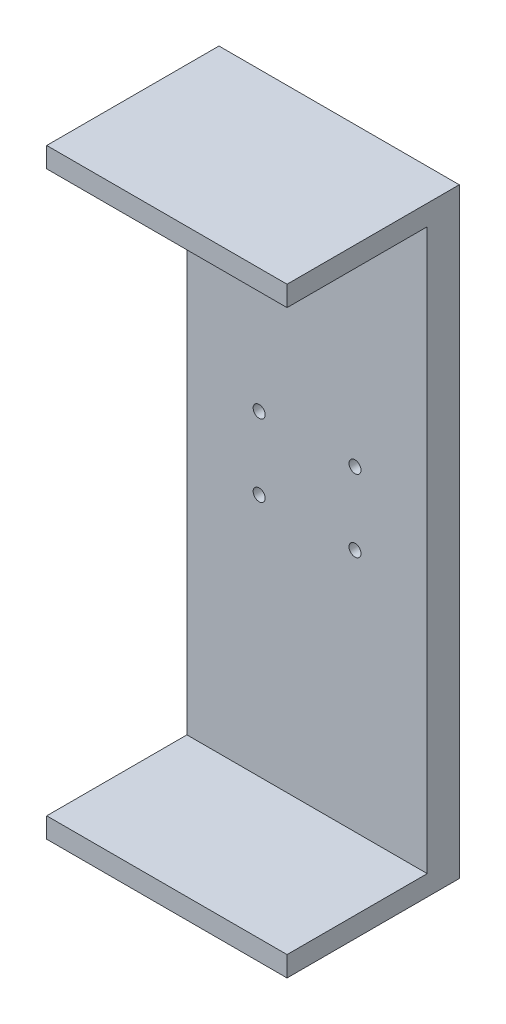
ISO-10303-21;
HEADER;
FILE_DESCRIPTION(('STEP AP214'),'2;1');
FILE_NAME('part.step','',(''),(''),'','','');
FILE_SCHEMA(('AUTOMOTIVE_DESIGN { 1 0 10303 214 1 1 1 1 }'));
ENDSEC;
DATA;
#1=APPLICATION_CONTEXT('core data for automotive mechanical design processes');
#2=APPLICATION_PROTOCOL_DEFINITION('international standard','automotive_design',2000,#1);
#3=PRODUCT_CONTEXT('',#1,'mechanical');
#4=PRODUCT('Part','Part','',(#3));
#5=PRODUCT_RELATED_PRODUCT_CATEGORY('part','',(#4));
#6=PRODUCT_DEFINITION_FORMATION('','',#4);
#7=PRODUCT_DEFINITION_CONTEXT('part definition',#1,'design');
#8=PRODUCT_DEFINITION('design','',#6,#7);
#9=PRODUCT_DEFINITION_SHAPE('','',#8);
#10=(LENGTH_UNIT() NAMED_UNIT(*) SI_UNIT(.MILLI.,.METRE.));
#11=(NAMED_UNIT(*) PLANE_ANGLE_UNIT() SI_UNIT($,.RADIAN.));
#12=(NAMED_UNIT(*) SI_UNIT($,.STERADIAN.) SOLID_ANGLE_UNIT());
#13=UNCERTAINTY_MEASURE_WITH_UNIT(LENGTH_MEASURE(1.E-05),#10,'distance_accuracy_value','');
#14=(GEOMETRIC_REPRESENTATION_CONTEXT(3) GLOBAL_UNCERTAINTY_ASSIGNED_CONTEXT((#13)) GLOBAL_UNIT_ASSIGNED_CONTEXT((#10,
#11,#12)) REPRESENTATION_CONTEXT('',''));
#15=CARTESIAN_POINT('',(0.,0.,0.));
#16=DIRECTION('',(0.,0.,1.));
#17=DIRECTION('',(1.,0.,0.));
#18=AXIS2_PLACEMENT_3D('',#15,#16,#17);
#19=CARTESIAN_POINT('',(0.,0.,8.));
#20=DIRECTION('',(0.,0.,1.));
#21=DIRECTION('',(1.,0.,0.));
#22=AXIS2_PLACEMENT_3D('',#19,#20,#21);
#23=PLANE('',#22);
#24=CARTESIAN_POINT('',(4.67,5.98317831307483,8.));
#25=DIRECTION('',(0.,0.,1.));
#26=DIRECTION('',(1.,0.,0.));
#27=AXIS2_PLACEMENT_3D('',#24,#25,#26);
#28=CIRCLE('',#27,1.5);
#29=CARTESIAN_POINT('',(6.17,5.98317831307483,8.));
#30=VERTEX_POINT('',#29);
#31=EDGE_CURVE('E175',#30,#30,#28,.T.);
#32=ORIENTED_EDGE('',*,*,#31,.F.);
#33=EDGE_LOOP('',(#32));
#34=FACE_BOUND('',#33,.T.);
#35=CARTESIAN_POINT('',(28.6,24.0168216869252,8.));
#36=DIRECTION('',(0.,0.,1.));
#37=DIRECTION('',(1.,0.,0.));
#38=AXIS2_PLACEMENT_3D('',#35,#36,#37);
#39=CIRCLE('',#38,1.5);
#40=CARTESIAN_POINT('',(30.1,24.0168216869252,8.));
#41=VERTEX_POINT('',#40);
#42=EDGE_CURVE('E191',#41,#41,#39,.T.);
#43=ORIENTED_EDGE('',*,*,#42,.F.);
#44=EDGE_LOOP('',(#43));
#45=FACE_BOUND('',#44,.T.);
#46=CARTESIAN_POINT('',(28.6,5.98317831307483,8.));
#47=DIRECTION('',(0.,0.,1.));
#48=DIRECTION('',(-1.,0.,0.));
#49=AXIS2_PLACEMENT_3D('',#46,#47,#48);
#50=CIRCLE('',#49,1.5);
#51=CARTESIAN_POINT('',(27.1,5.98317831307483,8.));
#52=VERTEX_POINT('',#51);
#53=EDGE_CURVE('E183',#52,#52,#50,.T.);
#54=ORIENTED_EDGE('',*,*,#53,.F.);
#55=EDGE_LOOP('',(#54));
#56=FACE_BOUND('',#55,.T.);
#57=CARTESIAN_POINT('',(4.67,24.0168216869252,8.));
#58=DIRECTION('',(0.,0.,1.));
#59=DIRECTION('',(-1.,0.,0.));
#60=AXIS2_PLACEMENT_3D('',#57,#58,#59);
#61=CIRCLE('',#60,1.5);
#62=CARTESIAN_POINT('',(3.17,24.0168216869252,8.));
#63=VERTEX_POINT('',#62);
#64=EDGE_CURVE('E167',#63,#63,#61,.T.);
#65=ORIENTED_EDGE('',*,*,#64,.F.);
#66=EDGE_LOOP('',(#65));
#67=FACE_BOUND('',#66,.T.);
#68=DIRECTION('',(0.,-1.,0.));
#69=VECTOR('',#68,1.);
#70=CARTESIAN_POINT('',(-13.365,90.,8.));
#71=LINE('',#70,#69);
#72=CARTESIAN_POINT('',(-13.365,84.9335711848288,8.));
#73=VERTEX_POINT('',#72);
#74=CARTESIAN_POINT('',(-13.365,-54.9335711848287,8.));
#75=VERTEX_POINT('',#74);
#76=EDGE_CURVE('E64',#73,#75,#71,.T.);
#77=ORIENTED_EDGE('',*,*,#76,.T.);
#78=DIRECTION('',(-1.,0.,0.));
#79=VECTOR('',#78,1.);
#80=CARTESIAN_POINT('',(-13.365,-54.9335711848287,8.));
#81=LINE('',#80,#79);
#82=CARTESIAN_POINT('',(46.635,-54.9335711848287,8.));
#83=VERTEX_POINT('',#82);
#84=EDGE_CURVE('E59',#83,#75,#81,.T.);
#85=ORIENTED_EDGE('',*,*,#84,.F.);
#86=DIRECTION('',(0.,1.,0.));
#87=VECTOR('',#86,1.);
#88=CARTESIAN_POINT('',(46.635,90.,8.));
#89=LINE('',#88,#87);
#90=CARTESIAN_POINT('',(46.635,84.9335711848288,8.));
#91=VERTEX_POINT('',#90);
#92=EDGE_CURVE('E199',#83,#91,#89,.T.);
#93=ORIENTED_EDGE('',*,*,#92,.T.);
#94=DIRECTION('',(1.,0.,0.));
#95=VECTOR('',#94,1.);
#96=CARTESIAN_POINT('',(-13.365,84.9335711848288,8.));
#97=LINE('',#96,#95);
#98=EDGE_CURVE('E136',#73,#91,#97,.T.);
#99=ORIENTED_EDGE('',*,*,#98,.F.);
#100=EDGE_LOOP('',(#77,#85,#93,#99));
#101=FACE_BOUND('',#100,.T.);
#102=ADVANCED_FACE('F43',(#34,#45,#56,#67,#101),#23,.T.);
#103=CARTESIAN_POINT('',(0.,0.,0.));
#104=DIRECTION('',(0.,0.,1.));
#105=DIRECTION('',(1.,0.,0.));
#106=AXIS2_PLACEMENT_3D('',#103,#104,#105);
#107=PLANE('',#106);
#108=DIRECTION('',(0.,1.,0.));
#109=VECTOR('',#108,1.);
#110=CARTESIAN_POINT('',(46.635,90.,0.));
#111=LINE('',#110,#109);
#112=CARTESIAN_POINT('',(46.635,-60.,0.));
#113=VERTEX_POINT('',#112);
#114=CARTESIAN_POINT('',(46.635,90.,0.));
#115=VERTEX_POINT('',#114);
#116=EDGE_CURVE('E195',#113,#115,#111,.T.);
#117=ORIENTED_EDGE('',*,*,#116,.F.);
#118=DIRECTION('',(1.,0.,0.));
#119=VECTOR('',#118,1.);
#120=CARTESIAN_POINT('',(-13.365,-60.,0.));
#121=LINE('',#120,#119);
#122=CARTESIAN_POINT('',(-13.365,-60.,0.));
#123=VERTEX_POINT('',#122);
#124=EDGE_CURVE('E202',#123,#113,#121,.T.);
#125=ORIENTED_EDGE('',*,*,#124,.F.);
#126=DIRECTION('',(0.,-1.,0.));
#127=VECTOR('',#126,1.);
#128=CARTESIAN_POINT('',(-13.365,90.,0.));
#129=LINE('',#128,#127);
#130=CARTESIAN_POINT('',(-13.365,90.,0.));
#131=VERTEX_POINT('',#130);
#132=EDGE_CURVE('E212',#131,#123,#129,.T.);
#133=ORIENTED_EDGE('',*,*,#132,.F.);
#134=DIRECTION('',(-1.,0.,0.));
#135=VECTOR('',#134,1.);
#136=CARTESIAN_POINT('',(-13.365,90.,0.));
#137=LINE('',#136,#135);
#138=EDGE_CURVE('E209',#115,#131,#137,.T.);
#139=ORIENTED_EDGE('',*,*,#138,.F.);
#140=EDGE_LOOP('',(#117,#125,#133,#139));
#141=FACE_BOUND('',#140,.T.);
#142=CARTESIAN_POINT('',(28.6,24.0168216869252,0.));
#143=DIRECTION('',(0.,0.,1.));
#144=DIRECTION('',(1.,0.,0.));
#145=AXIS2_PLACEMENT_3D('',#142,#143,#144);
#146=CIRCLE('',#145,1.5);
#147=CARTESIAN_POINT('',(30.1,24.0168216869252,0.));
#148=VERTEX_POINT('',#147);
#149=EDGE_CURVE('E187',#148,#148,#146,.T.);
#150=ORIENTED_EDGE('',*,*,#149,.T.);
#151=EDGE_LOOP('',(#150));
#152=FACE_BOUND('',#151,.T.);
#153=CARTESIAN_POINT('',(28.6,5.98317831307483,0.));
#154=DIRECTION('',(0.,0.,1.));
#155=DIRECTION('',(-1.,0.,0.));
#156=AXIS2_PLACEMENT_3D('',#153,#154,#155);
#157=CIRCLE('',#156,1.5);
#158=CARTESIAN_POINT('',(27.1,5.98317831307483,0.));
#159=VERTEX_POINT('',#158);
#160=EDGE_CURVE('E179',#159,#159,#157,.T.);
#161=ORIENTED_EDGE('',*,*,#160,.T.);
#162=EDGE_LOOP('',(#161));
#163=FACE_BOUND('',#162,.T.);
#164=CARTESIAN_POINT('',(4.67,5.98317831307483,0.));
#165=DIRECTION('',(0.,0.,1.));
#166=DIRECTION('',(1.,0.,0.));
#167=AXIS2_PLACEMENT_3D('',#164,#165,#166);
#168=CIRCLE('',#167,1.5);
#169=CARTESIAN_POINT('',(6.17,5.98317831307483,0.));
#170=VERTEX_POINT('',#169);
#171=EDGE_CURVE('E171',#170,#170,#168,.T.);
#172=ORIENTED_EDGE('',*,*,#171,.T.);
#173=EDGE_LOOP('',(#172));
#174=FACE_BOUND('',#173,.T.);
#175=CARTESIAN_POINT('',(4.67,24.0168216869252,0.));
#176=DIRECTION('',(0.,0.,1.));
#177=DIRECTION('',(-1.,0.,0.));
#178=AXIS2_PLACEMENT_3D('',#175,#176,#177);
#179=CIRCLE('',#178,1.5);
#180=CARTESIAN_POINT('',(3.17,24.0168216869252,0.));
#181=VERTEX_POINT('',#180);
#182=EDGE_CURVE('E166',#181,#181,#179,.T.);
#183=ORIENTED_EDGE('',*,*,#182,.T.);
#184=EDGE_LOOP('',(#183));
#185=FACE_BOUND('',#184,.T.);
#186=ADVANCED_FACE('F231',(#141,#152,#163,#174,#185),#107,.F.);
#187=CARTESIAN_POINT('',(46.635,90.,8.));
#188=DIRECTION('',(-1.,0.,0.));
#189=DIRECTION('',(0.,-1.,0.));
#190=AXIS2_PLACEMENT_3D('',#187,#188,#189);
#191=PLANE('',#190);
#192=ORIENTED_EDGE('',*,*,#116,.T.);
#193=DIRECTION('',(0.,0.,-1.));
#194=VECTOR('',#193,1.);
#195=CARTESIAN_POINT('',(46.635,90.,8.));
#196=LINE('',#195,#194);
#197=CARTESIAN_POINT('',(46.635,90.,43.));
#198=VERTEX_POINT('',#197);
#199=EDGE_CURVE('E11',#198,#115,#196,.T.);
#200=ORIENTED_EDGE('',*,*,#199,.F.);
#201=DIRECTION('',(0.,1.,0.));
#202=VECTOR('',#201,1.);
#203=CARTESIAN_POINT('',(46.635,84.9335711848288,43.));
#204=LINE('',#203,#202);
#205=CARTESIAN_POINT('',(46.635,84.9335711848288,43.));
#206=VERTEX_POINT('',#205);
#207=EDGE_CURVE('E141',#206,#198,#204,.T.);
#208=ORIENTED_EDGE('',*,*,#207,.F.);
#209=DIRECTION('',(0.,0.,-1.));
#210=VECTOR('',#209,1.);
#211=CARTESIAN_POINT('',(46.635,84.9335711848288,43.));
#212=LINE('',#211,#210);
#213=EDGE_CURVE('E155',#206,#91,#212,.T.);
#214=ORIENTED_EDGE('',*,*,#213,.T.);
#215=ORIENTED_EDGE('',*,*,#92,.F.);
#216=DIRECTION('',(0.,0.,-1.));
#217=VECTOR('',#216,1.);
#218=CARTESIAN_POINT('',(46.635,-54.9335711848287,43.));
#219=LINE('',#218,#217);
#220=CARTESIAN_POINT('',(46.635,-54.9335711848287,43.));
#221=VERTEX_POINT('',#220);
#222=EDGE_CURVE('E125',#221,#83,#219,.T.);
#223=ORIENTED_EDGE('',*,*,#222,.F.);
#224=DIRECTION('',(0.,1.,0.));
#225=VECTOR('',#224,1.);
#226=CARTESIAN_POINT('',(46.635,-54.9335711848287,43.));
#227=LINE('',#226,#225);
#228=CARTESIAN_POINT('',(46.635,-60.,43.));
#229=VERTEX_POINT('',#228);
#230=EDGE_CURVE('E114',#229,#221,#227,.T.);
#231=ORIENTED_EDGE('',*,*,#230,.F.);
#232=DIRECTION('',(0.,0.,-1.));
#233=VECTOR('',#232,1.);
#234=CARTESIAN_POINT('',(46.635,-60.,8.));
#235=LINE('',#234,#233);
#236=EDGE_CURVE('E205',#229,#113,#235,.T.);
#237=ORIENTED_EDGE('',*,*,#236,.T.);
#238=EDGE_LOOP('',(#192,#200,#208,#214,#215,#223,#231,#237));
#239=FACE_BOUND('',#238,.T.);
#240=ADVANCED_FACE('F45',(#239),#191,.F.);
#241=CARTESIAN_POINT('',(-13.365,90.,8.));
#242=DIRECTION('',(0.,-1.,0.));
#243=DIRECTION('',(0.,0.,-1.));
#244=AXIS2_PLACEMENT_3D('',#241,#242,#243);
#245=PLANE('',#244);
#246=ORIENTED_EDGE('',*,*,#138,.T.);
#247=DIRECTION('',(0.,0.,-1.));
#248=VECTOR('',#247,1.);
#249=CARTESIAN_POINT('',(-13.365,90.,8.));
#250=LINE('',#249,#248);
#251=CARTESIAN_POINT('',(-13.365,90.,43.));
#252=VERTEX_POINT('',#251);
#253=EDGE_CURVE('E52',#252,#131,#250,.T.);
#254=ORIENTED_EDGE('',*,*,#253,.F.);
#255=DIRECTION('',(-1.,0.,0.));
#256=VECTOR('',#255,1.);
#257=CARTESIAN_POINT('',(46.635,90.,43.));
#258=LINE('',#257,#256);
#259=EDGE_CURVE('E145',#198,#252,#258,.T.);
#260=ORIENTED_EDGE('',*,*,#259,.F.);
#261=ORIENTED_EDGE('',*,*,#199,.T.);
#262=EDGE_LOOP('',(#246,#254,#260,#261));
#263=FACE_BOUND('',#262,.T.);
#264=ADVANCED_FACE('F246',(#263),#245,.F.);
#265=CARTESIAN_POINT('',(-13.365,90.,8.));
#266=DIRECTION('',(1.,0.,0.));
#267=DIRECTION('',(0.,1.,0.));
#268=AXIS2_PLACEMENT_3D('',#265,#266,#267);
#269=PLANE('',#268);
#270=ORIENTED_EDGE('',*,*,#132,.T.);
#271=DIRECTION('',(0.,0.,-1.));
#272=VECTOR('',#271,1.);
#273=CARTESIAN_POINT('',(-13.365,-60.,8.));
#274=LINE('',#273,#272);
#275=CARTESIAN_POINT('',(-13.365,-60.,43.));
#276=VERTEX_POINT('',#275);
#277=EDGE_CURVE('E129',#276,#123,#274,.T.);
#278=ORIENTED_EDGE('',*,*,#277,.F.);
#279=DIRECTION('',(0.,-1.,0.));
#280=VECTOR('',#279,1.);
#281=CARTESIAN_POINT('',(-13.365,-60.,43.));
#282=LINE('',#281,#280);
#283=CARTESIAN_POINT('',(-13.365,-54.9335711848287,43.));
#284=VERTEX_POINT('',#283);
#285=EDGE_CURVE('E112',#284,#276,#282,.T.);
#286=ORIENTED_EDGE('',*,*,#285,.F.);
#287=DIRECTION('',(0.,0.,-1.));
#288=VECTOR('',#287,1.);
#289=CARTESIAN_POINT('',(-13.365,-54.9335711848287,43.));
#290=LINE('',#289,#288);
#291=EDGE_CURVE('E119',#284,#75,#290,.T.);
#292=ORIENTED_EDGE('',*,*,#291,.T.);
#293=ORIENTED_EDGE('',*,*,#76,.F.);
#294=DIRECTION('',(0.,0.,-1.));
#295=VECTOR('',#294,1.);
#296=CARTESIAN_POINT('',(-13.365,84.9335711848288,43.));
#297=LINE('',#296,#295);
#298=CARTESIAN_POINT('',(-13.365,84.9335711848288,43.));
#299=VERTEX_POINT('',#298);
#300=EDGE_CURVE('E162',#299,#73,#297,.T.);
#301=ORIENTED_EDGE('',*,*,#300,.F.);
#302=DIRECTION('',(0.,-1.,0.));
#303=VECTOR('',#302,1.);
#304=CARTESIAN_POINT('',(-13.365,90.,43.));
#305=LINE('',#304,#303);
#306=EDGE_CURVE('E149',#252,#299,#305,.T.);
#307=ORIENTED_EDGE('',*,*,#306,.F.);
#308=ORIENTED_EDGE('',*,*,#253,.T.);
#309=EDGE_LOOP('',(#270,#278,#286,#292,#293,#301,#307,#308));
#310=FACE_BOUND('',#309,.T.);
#311=ADVANCED_FACE('F127',(#310),#269,.F.);
#312=CARTESIAN_POINT('',(-13.365,-60.,8.));
#313=DIRECTION('',(0.,1.,0.));
#314=DIRECTION('',(0.,0.,1.));
#315=AXIS2_PLACEMENT_3D('',#312,#313,#314);
#316=PLANE('',#315);
#317=ORIENTED_EDGE('',*,*,#124,.T.);
#318=ORIENTED_EDGE('',*,*,#236,.F.);
#319=DIRECTION('',(1.,0.,0.));
#320=VECTOR('',#319,1.);
#321=CARTESIAN_POINT('',(46.635,-60.,43.));
#322=LINE('',#321,#320);
#323=EDGE_CURVE('E132',#276,#229,#322,.T.);
#324=ORIENTED_EDGE('',*,*,#323,.F.);
#325=ORIENTED_EDGE('',*,*,#277,.T.);
#326=EDGE_LOOP('',(#317,#318,#324,#325));
#327=FACE_BOUND('',#326,.T.);
#328=ADVANCED_FACE('F234',(#327),#316,.F.);
#329=CARTESIAN_POINT('',(28.6,24.0168216869252,8.));
#330=DIRECTION('',(0.,0.,-1.));
#331=DIRECTION('',(-1.,0.,0.));
#332=AXIS2_PLACEMENT_3D('',#329,#330,#331);
#333=CYLINDRICAL_SURFACE('',#332,1.5);
#334=ORIENTED_EDGE('',*,*,#42,.T.);
#335=EDGE_LOOP('',(#334));
#336=FACE_BOUND('',#335,.T.);
#337=ORIENTED_EDGE('',*,*,#149,.F.);
#338=EDGE_LOOP('',(#337));
#339=FACE_BOUND('',#338,.T.);
#340=ADVANCED_FACE('F263',(#336,#339),#333,.F.);
#341=CARTESIAN_POINT('',(28.6,5.98317831307483,8.));
#342=DIRECTION('',(0.,0.,-1.));
#343=DIRECTION('',(-1.,0.,0.));
#344=AXIS2_PLACEMENT_3D('',#341,#342,#343);
#345=CYLINDRICAL_SURFACE('',#344,1.5);
#346=ORIENTED_EDGE('',*,*,#53,.T.);
#347=EDGE_LOOP('',(#346));
#348=FACE_BOUND('',#347,.T.);
#349=ORIENTED_EDGE('',*,*,#160,.F.);
#350=EDGE_LOOP('',(#349));
#351=FACE_BOUND('',#350,.T.);
#352=ADVANCED_FACE('F270',(#348,#351),#345,.F.);
#353=CARTESIAN_POINT('',(4.67,5.98317831307483,8.));
#354=DIRECTION('',(0.,0.,-1.));
#355=DIRECTION('',(-1.,0.,0.));
#356=AXIS2_PLACEMENT_3D('',#353,#354,#355);
#357=CYLINDRICAL_SURFACE('',#356,1.5);
#358=ORIENTED_EDGE('',*,*,#31,.T.);
#359=EDGE_LOOP('',(#358));
#360=FACE_BOUND('',#359,.T.);
#361=ORIENTED_EDGE('',*,*,#171,.F.);
#362=EDGE_LOOP('',(#361));
#363=FACE_BOUND('',#362,.T.);
#364=ADVANCED_FACE('F275',(#360,#363),#357,.F.);
#365=CARTESIAN_POINT('',(4.67,24.0168216869252,8.));
#366=DIRECTION('',(0.,0.,-1.));
#367=DIRECTION('',(-1.,0.,0.));
#368=AXIS2_PLACEMENT_3D('',#365,#366,#367);
#369=CYLINDRICAL_SURFACE('',#368,1.5);
#370=ORIENTED_EDGE('',*,*,#64,.T.);
#371=EDGE_LOOP('',(#370));
#372=FACE_BOUND('',#371,.T.);
#373=ORIENTED_EDGE('',*,*,#182,.F.);
#374=EDGE_LOOP('',(#373));
#375=FACE_BOUND('',#374,.T.);
#376=ADVANCED_FACE('F287',(#372,#375),#369,.F.);
#377=CARTESIAN_POINT('',(-13.365,84.9335711848288,43.));
#378=DIRECTION('',(0.,1.,0.));
#379=DIRECTION('',(0.,0.,1.));
#380=AXIS2_PLACEMENT_3D('',#377,#378,#379);
#381=PLANE('',#380);
#382=ORIENTED_EDGE('',*,*,#98,.T.);
#383=ORIENTED_EDGE('',*,*,#213,.F.);
#384=DIRECTION('',(1.,0.,0.));
#385=VECTOR('',#384,1.);
#386=CARTESIAN_POINT('',(-13.365,84.9335711848288,43.));
#387=LINE('',#386,#385);
#388=EDGE_CURVE('E152',#299,#206,#387,.T.);
#389=ORIENTED_EDGE('',*,*,#388,.F.);
#390=ORIENTED_EDGE('',*,*,#300,.T.);
#391=EDGE_LOOP('',(#382,#383,#389,#390));
#392=FACE_BOUND('',#391,.T.);
#393=ADVANCED_FACE('F242',(#392),#381,.F.);
#394=CARTESIAN_POINT('',(0.,0.,43.));
#395=DIRECTION('',(0.,0.,1.));
#396=DIRECTION('',(1.,0.,0.));
#397=AXIS2_PLACEMENT_3D('',#394,#395,#396);
#398=PLANE('',#397);
#399=ORIENTED_EDGE('',*,*,#207,.T.);
#400=ORIENTED_EDGE('',*,*,#259,.T.);
#401=ORIENTED_EDGE('',*,*,#306,.T.);
#402=ORIENTED_EDGE('',*,*,#388,.T.);
#403=EDGE_LOOP('',(#399,#400,#401,#402));
#404=FACE_BOUND('',#403,.T.);
#405=ADVANCED_FACE('F245',(#404),#398,.T.);
#406=CARTESIAN_POINT('',(-13.365,-54.9335711848287,43.));
#407=DIRECTION('',(0.,-1.,0.));
#408=DIRECTION('',(0.,0.,-1.));
#409=AXIS2_PLACEMENT_3D('',#406,#407,#408);
#410=PLANE('',#409);
#411=ORIENTED_EDGE('',*,*,#84,.T.);
#412=ORIENTED_EDGE('',*,*,#291,.F.);
#413=DIRECTION('',(-1.,0.,0.));
#414=VECTOR('',#413,1.);
#415=CARTESIAN_POINT('',(-13.365,-54.9335711848287,43.));
#416=LINE('',#415,#414);
#417=EDGE_CURVE('E107',#221,#284,#416,.T.);
#418=ORIENTED_EDGE('',*,*,#417,.F.);
#419=ORIENTED_EDGE('',*,*,#222,.T.);
#420=EDGE_LOOP('',(#411,#412,#418,#419));
#421=FACE_BOUND('',#420,.T.);
#422=ADVANCED_FACE('F122',(#421),#410,.F.);
#423=CARTESIAN_POINT('',(0.,0.,43.));
#424=DIRECTION('',(0.,0.,-1.));
#425=DIRECTION('',(-1.,0.,0.));
#426=AXIS2_PLACEMENT_3D('',#423,#424,#425);
#427=PLANE('',#426);
#428=ORIENTED_EDGE('',*,*,#285,.T.);
#429=ORIENTED_EDGE('',*,*,#323,.T.);
#430=ORIENTED_EDGE('',*,*,#230,.T.);
#431=ORIENTED_EDGE('',*,*,#417,.T.);
#432=EDGE_LOOP('',(#428,#429,#430,#431));
#433=FACE_BOUND('',#432,.T.);
#434=ADVANCED_FACE('F109',(#433),#427,.F.);
#435=CLOSED_SHELL('',(#102,#186,#240,#264,#311,#328,#340,#352,#364,#376,#393,#405,#422,#434));
#436=MANIFOLD_SOLID_BREP('B2',#435);
#437=ADVANCED_BREP_SHAPE_REPRESENTATION('',(#18,#436),#14);
#438=SHAPE_DEFINITION_REPRESENTATION(#9,#437);
ENDSEC;
END-ISO-10303-21;
